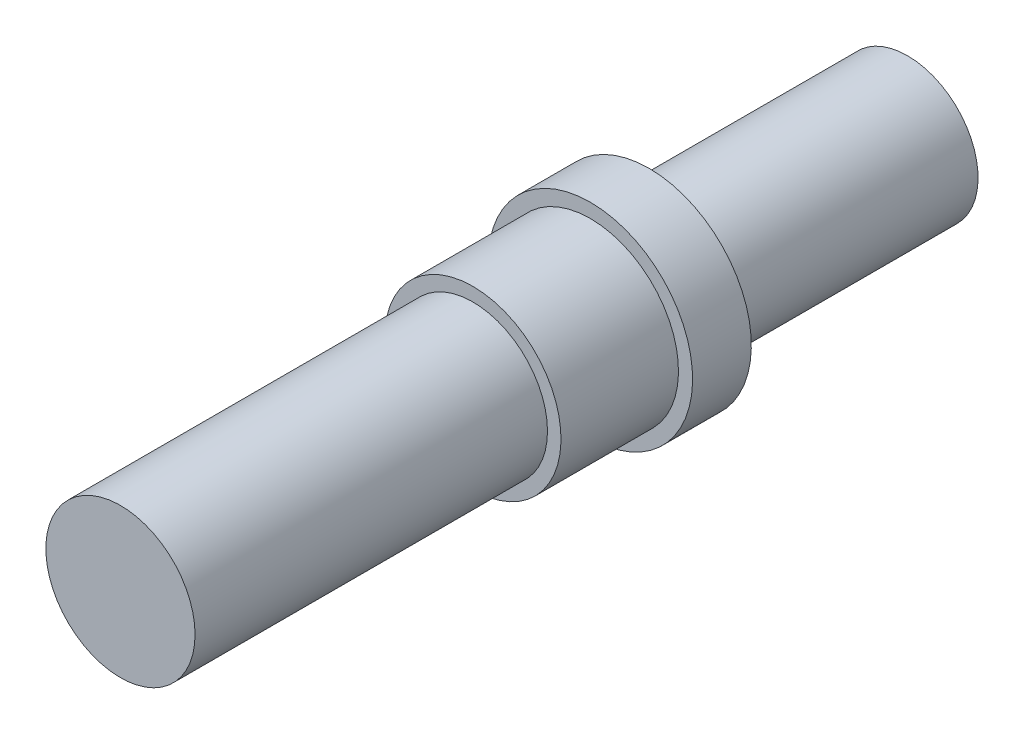
ISO-10303-21;
HEADER;
FILE_DESCRIPTION(('STEP AP214'),'2;1');
FILE_NAME('part.step','',(''),(''),'','','');
FILE_SCHEMA(('AUTOMOTIVE_DESIGN { 1 0 10303 214 1 1 1 1 }'));
ENDSEC;
DATA;
#1=APPLICATION_CONTEXT('core data for automotive mechanical design processes');
#2=APPLICATION_PROTOCOL_DEFINITION('international standard','automotive_design',2000,#1);
#3=PRODUCT_CONTEXT('',#1,'mechanical');
#4=PRODUCT('Part','Part','',(#3));
#5=PRODUCT_RELATED_PRODUCT_CATEGORY('part','',(#4));
#6=PRODUCT_DEFINITION_FORMATION('','',#4);
#7=PRODUCT_DEFINITION_CONTEXT('part definition',#1,'design');
#8=PRODUCT_DEFINITION('design','',#6,#7);
#9=PRODUCT_DEFINITION_SHAPE('','',#8);
#10=(LENGTH_UNIT() NAMED_UNIT(*) SI_UNIT(.MILLI.,.METRE.));
#11=(NAMED_UNIT(*) PLANE_ANGLE_UNIT() SI_UNIT($,.RADIAN.));
#12=(NAMED_UNIT(*) SI_UNIT($,.STERADIAN.) SOLID_ANGLE_UNIT());
#13=UNCERTAINTY_MEASURE_WITH_UNIT(LENGTH_MEASURE(1.E-05),#10,'distance_accuracy_value','');
#14=(GEOMETRIC_REPRESENTATION_CONTEXT(3) GLOBAL_UNCERTAINTY_ASSIGNED_CONTEXT((#13)) GLOBAL_UNIT_ASSIGNED_CONTEXT((#10,
#11,#12)) REPRESENTATION_CONTEXT('',''));
#15=CARTESIAN_POINT('',(0.,0.,0.));
#16=DIRECTION('',(0.,0.,1.));
#17=DIRECTION('',(1.,0.,0.));
#18=AXIS2_PLACEMENT_3D('',#15,#16,#17);
#19=CARTESIAN_POINT('',(0.,7.5,0.00178042258444941));
#20=DIRECTION('',(0.,0.,1.));
#21=DIRECTION('',(0.,-1.,0.));
#22=AXIS2_PLACEMENT_3D('',#19,#20,#21);
#23=PLANE('',#22);
#24=CARTESIAN_POINT('',(0.,0.,0.00178042258444959));
#25=DIRECTION('',(0.,0.,1.));
#26=DIRECTION('',(1.,0.,0.));
#27=AXIS2_PLACEMENT_3D('',#24,#25,#26);
#28=CIRCLE('',#27,6.35);
#29=CARTESIAN_POINT('',(6.35,0.,0.00178042258444959));
#30=VERTEX_POINT('',#29);
#31=EDGE_CURVE('E10',#30,#30,#28,.T.);
#32=ORIENTED_EDGE('',*,*,#31,.F.);
#33=EDGE_LOOP('',(#32));
#34=FACE_BOUND('',#33,.T.);
#35=CARTESIAN_POINT('',(0.,0.,0.00178042258445338));
#36=DIRECTION('',(0.,0.,-1.));
#37=DIRECTION('',(0.,1.,0.));
#38=AXIS2_PLACEMENT_3D('',#35,#36,#37);
#39=CIRCLE('',#38,7.5);
#40=CARTESIAN_POINT('',(0.,7.5,0.00178042258445319));
#41=VERTEX_POINT('',#40);
#42=EDGE_CURVE('E54',#41,#41,#39,.T.);
#43=ORIENTED_EDGE('',*,*,#42,.F.);
#44=EDGE_LOOP('',(#43));
#45=FACE_BOUND('',#44,.T.);
#46=ADVANCED_FACE('F51',(#34,#45),#23,.T.);
#47=CARTESIAN_POINT('',(0.,0.,-34.9982195774155));
#48=DIRECTION('',(0.,0.,-1.));
#49=DIRECTION('',(0.,1.,0.));
#50=AXIS2_PLACEMENT_3D('',#47,#48,#49);
#51=CYLINDRICAL_SURFACE('',#50,7.5);
#52=ORIENTED_EDGE('',*,*,#42,.T.);
#53=EDGE_LOOP('',(#52));
#54=FACE_BOUND('',#53,.T.);
#55=CARTESIAN_POINT('',(0.,0.,-9.99821957741555));
#56=DIRECTION('',(0.,0.,-1.));
#57=DIRECTION('',(0.,1.,0.));
#58=AXIS2_PLACEMENT_3D('',#55,#56,#57);
#59=CIRCLE('',#58,7.49999999999999);
#60=CARTESIAN_POINT('',(0.,7.49999999999999,-9.99821957741555));
#61=VERTEX_POINT('',#60);
#62=EDGE_CURVE('E62',#61,#61,#59,.T.);
#63=ORIENTED_EDGE('',*,*,#62,.F.);
#64=EDGE_LOOP('',(#63));
#65=FACE_BOUND('',#64,.T.);
#66=ADVANCED_FACE('F81',(#54,#65),#51,.T.);
#67=CARTESIAN_POINT('',(0.,7.49999999999999,-9.99821957741555));
#68=DIRECTION('',(0.,0.,1.));
#69=DIRECTION('',(0.,-1.,0.));
#70=AXIS2_PLACEMENT_3D('',#67,#68,#69);
#71=PLANE('',#70);
#72=ORIENTED_EDGE('',*,*,#62,.T.);
#73=EDGE_LOOP('',(#72));
#74=FACE_BOUND('',#73,.T.);
#75=CARTESIAN_POINT('',(0.,0.,-9.99821957741555));
#76=DIRECTION('',(0.,0.,-1.));
#77=DIRECTION('',(0.,1.,0.));
#78=AXIS2_PLACEMENT_3D('',#75,#76,#77);
#79=CIRCLE('',#78,8.7);
#80=CARTESIAN_POINT('',(0.,8.7,-9.99821957741555));
#81=VERTEX_POINT('',#80);
#82=EDGE_CURVE('E73',#81,#81,#79,.T.);
#83=ORIENTED_EDGE('',*,*,#82,.F.);
#84=EDGE_LOOP('',(#83));
#85=FACE_BOUND('',#84,.T.);
#86=ADVANCED_FACE('F78',(#74,#85),#71,.T.);
#87=CARTESIAN_POINT('',(0.,0.,-34.9982195774155));
#88=DIRECTION('',(0.,0.,-1.));
#89=DIRECTION('',(0.,1.,0.));
#90=AXIS2_PLACEMENT_3D('',#87,#88,#89);
#91=CYLINDRICAL_SURFACE('',#90,8.7);
#92=ORIENTED_EDGE('',*,*,#82,.T.);
#93=EDGE_LOOP('',(#92));
#94=FACE_BOUND('',#93,.T.);
#95=CARTESIAN_POINT('',(0.,0.,-14.9982195774155));
#96=DIRECTION('',(0.,0.,-1.));
#97=DIRECTION('',(0.,1.,0.));
#98=AXIS2_PLACEMENT_3D('',#95,#96,#97);
#99=CIRCLE('',#98,8.7);
#100=CARTESIAN_POINT('',(0.,8.7,-14.9982195774155));
#101=VERTEX_POINT('',#100);
#102=EDGE_CURVE('E70',#101,#101,#99,.T.);
#103=ORIENTED_EDGE('',*,*,#102,.F.);
#104=EDGE_LOOP('',(#103));
#105=FACE_BOUND('',#104,.T.);
#106=ADVANCED_FACE('F87',(#94,#105),#91,.T.);
#107=CARTESIAN_POINT('',(0.,8.7,-14.9982195774155));
#108=DIRECTION('',(0.,0.,-1.));
#109=DIRECTION('',(0.,1.,0.));
#110=AXIS2_PLACEMENT_3D('',#107,#108,#109);
#111=PLANE('',#110);
#112=ORIENTED_EDGE('',*,*,#102,.T.);
#113=EDGE_LOOP('',(#112));
#114=FACE_BOUND('',#113,.T.);
#115=CARTESIAN_POINT('',(0.,0.,-14.9982195774156));
#116=DIRECTION('',(0.,0.,-1.));
#117=DIRECTION('',(0.,1.,0.));
#118=AXIS2_PLACEMENT_3D('',#115,#116,#117);
#119=CIRCLE('',#118,6.);
#120=CARTESIAN_POINT('',(0.,6.,-14.9982195774156));
#121=VERTEX_POINT('',#120);
#122=EDGE_CURVE('E67',#121,#121,#119,.T.);
#123=ORIENTED_EDGE('',*,*,#122,.F.);
#124=EDGE_LOOP('',(#123));
#125=FACE_BOUND('',#124,.T.);
#126=ADVANCED_FACE('F94',(#114,#125),#111,.T.);
#127=CARTESIAN_POINT('',(0.,0.,-34.9982195774155));
#128=DIRECTION('',(0.,0.,-1.));
#129=DIRECTION('',(0.,1.,0.));
#130=AXIS2_PLACEMENT_3D('',#127,#128,#129);
#131=CYLINDRICAL_SURFACE('',#130,6.);
#132=ORIENTED_EDGE('',*,*,#122,.T.);
#133=EDGE_LOOP('',(#132));
#134=FACE_BOUND('',#133,.T.);
#135=CARTESIAN_POINT('',(0.,0.,-36.9982195774155));
#136=DIRECTION('',(0.,0.,-1.));
#137=DIRECTION('',(-1.,0.,0.));
#138=AXIS2_PLACEMENT_3D('',#135,#136,#137);
#139=CIRCLE('',#138,6.);
#140=CARTESIAN_POINT('',(-6.,0.,-36.9982195774155));
#141=VERTEX_POINT('',#140);
#142=EDGE_CURVE('E116',#141,#141,#139,.T.);
#143=ORIENTED_EDGE('',*,*,#142,.F.);
#144=EDGE_LOOP('',(#143));
#145=FACE_BOUND('',#144,.T.);
#146=ADVANCED_FACE('F98',(#134,#145),#131,.T.);
#147=CARTESIAN_POINT('',(0.,0.,30.0017804225844));
#148=DIRECTION('',(0.,0.,-1.));
#149=DIRECTION('',(-1.,0.,0.));
#150=AXIS2_PLACEMENT_3D('',#147,#148,#149);
#151=CYLINDRICAL_SURFACE('',#150,6.35);
#152=CARTESIAN_POINT('',(0.,0.,30.0017804225844));
#153=DIRECTION('',(0.,0.,1.));
#154=DIRECTION('',(1.,0.,0.));
#155=AXIS2_PLACEMENT_3D('',#152,#153,#154);
#156=CIRCLE('',#155,6.35);
#157=CARTESIAN_POINT('',(6.35,0.,30.0017804225844));
#158=VERTEX_POINT('',#157);
#159=EDGE_CURVE('E65',#158,#158,#156,.T.);
#160=ORIENTED_EDGE('',*,*,#159,.F.);
#161=EDGE_LOOP('',(#160));
#162=FACE_BOUND('',#161,.T.);
#163=ORIENTED_EDGE('',*,*,#31,.T.);
#164=EDGE_LOOP('',(#163));
#165=FACE_BOUND('',#164,.T.);
#166=ADVANCED_FACE('F101',(#162,#165),#151,.T.);
#167=CARTESIAN_POINT('',(0.,0.,30.0017804225844));
#168=DIRECTION('',(0.,0.,1.));
#169=DIRECTION('',(1.,0.,0.));
#170=AXIS2_PLACEMENT_3D('',#167,#168,#169);
#171=PLANE('',#170);
#172=ORIENTED_EDGE('',*,*,#159,.T.);
#173=EDGE_LOOP('',(#172));
#174=FACE_BOUND('',#173,.T.);
#175=ADVANCED_FACE('F105',(#174),#171,.T.);
#176=CARTESIAN_POINT('',(0.,0.,-36.9982195774155));
#177=DIRECTION('',(0.,0.,-1.));
#178=DIRECTION('',(-1.,0.,0.));
#179=AXIS2_PLACEMENT_3D('',#176,#177,#178);
#180=PLANE('',#179);
#181=ORIENTED_EDGE('',*,*,#142,.T.);
#182=EDGE_LOOP('',(#181));
#183=FACE_BOUND('',#182,.T.);
#184=ADVANCED_FACE('F109',(#183),#180,.T.);
#185=CLOSED_SHELL('',(#46,#66,#86,#106,#126,#146,#166,#175,#184));
#186=MANIFOLD_SOLID_BREP('B2',#185);
#187=ADVANCED_BREP_SHAPE_REPRESENTATION('',(#18,#186),#14);
#188=SHAPE_DEFINITION_REPRESENTATION(#9,#187);
ENDSEC;
END-ISO-10303-21;
